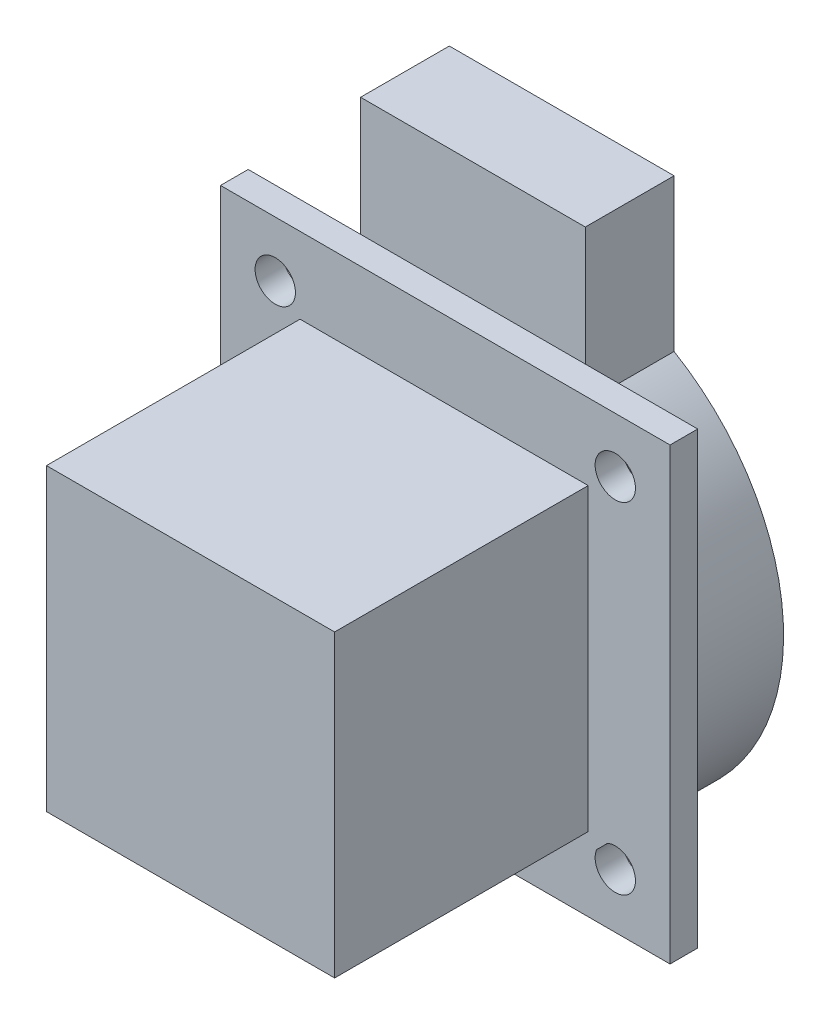
ISO-10303-21;
HEADER;
FILE_DESCRIPTION(('STEP AP214'),'2;1');
FILE_NAME('part.step','',(''),(''),'','','');
FILE_SCHEMA(('AUTOMOTIVE_DESIGN { 1 0 10303 214 1 1 1 1 }'));
ENDSEC;
DATA;
#1=APPLICATION_CONTEXT('core data for automotive mechanical design processes');
#2=APPLICATION_PROTOCOL_DEFINITION('international standard','automotive_design',2000,#1);
#3=PRODUCT_CONTEXT('',#1,'mechanical');
#4=PRODUCT('Part','Part','',(#3));
#5=PRODUCT_RELATED_PRODUCT_CATEGORY('part','',(#4));
#6=PRODUCT_DEFINITION_FORMATION('','',#4);
#7=PRODUCT_DEFINITION_CONTEXT('part definition',#1,'design');
#8=PRODUCT_DEFINITION('design','',#6,#7);
#9=PRODUCT_DEFINITION_SHAPE('','',#8);
#10=(LENGTH_UNIT() NAMED_UNIT(*) SI_UNIT(.MILLI.,.METRE.));
#11=(NAMED_UNIT(*) PLANE_ANGLE_UNIT() SI_UNIT($,.RADIAN.));
#12=(NAMED_UNIT(*) SI_UNIT($,.STERADIAN.) SOLID_ANGLE_UNIT());
#13=UNCERTAINTY_MEASURE_WITH_UNIT(LENGTH_MEASURE(1.E-05),#10,'distance_accuracy_value','');
#14=(GEOMETRIC_REPRESENTATION_CONTEXT(3) GLOBAL_UNCERTAINTY_ASSIGNED_CONTEXT((#13)) GLOBAL_UNIT_ASSIGNED_CONTEXT((#10,
#11,#12)) REPRESENTATION_CONTEXT('',''));
#15=CARTESIAN_POINT('',(0.,0.,0.));
#16=DIRECTION('',(0.,0.,1.));
#17=DIRECTION('',(1.,0.,0.));
#18=AXIS2_PLACEMENT_3D('',#15,#16,#17);
#19=CARTESIAN_POINT('',(0.,0.,3.048));
#20=DIRECTION('',(0.,0.,-1.));
#21=DIRECTION('',(-1.,0.,0.));
#22=AXIS2_PLACEMENT_3D('',#19,#20,#21);
#23=PLANE('',#22);
#24=DIRECTION('',(0.,-1.,0.));
#25=VECTOR('',#24,1.);
#26=CARTESIAN_POINT('',(0.,0.,3.048));
#27=LINE('',#26,#25);
#28=CARTESIAN_POINT('',(0.,49.53,3.048));
#29=VERTEX_POINT('',#28);
#30=CARTESIAN_POINT('',(0.,0.,3.048));
#31=VERTEX_POINT('',#30);
#32=EDGE_CURVE('E257',#29,#31,#27,.T.);
#33=ORIENTED_EDGE('',*,*,#32,.T.);
#34=DIRECTION('',(1.,0.,0.));
#35=VECTOR('',#34,1.);
#36=CARTESIAN_POINT('',(0.,0.,3.048));
#37=LINE('',#36,#35);
#38=CARTESIAN_POINT('',(49.53,0.,3.048));
#39=VERTEX_POINT('',#38);
#40=EDGE_CURVE('E260',#31,#39,#37,.T.);
#41=ORIENTED_EDGE('',*,*,#40,.T.);
#42=DIRECTION('',(0.,1.,0.));
#43=VECTOR('',#42,1.);
#44=CARTESIAN_POINT('',(49.53,0.,3.048));
#45=LINE('',#44,#43);
#46=CARTESIAN_POINT('',(49.53,49.53,3.048));
#47=VERTEX_POINT('',#46);
#48=EDGE_CURVE('E263',#39,#47,#45,.T.);
#49=ORIENTED_EDGE('',*,*,#48,.T.);
#50=DIRECTION('',(-1.,0.,0.));
#51=VECTOR('',#50,1.);
#52=CARTESIAN_POINT('',(0.,49.53,3.048));
#53=LINE('',#52,#51);
#54=EDGE_CURVE('E265',#47,#29,#53,.T.);
#55=ORIENTED_EDGE('',*,*,#54,.T.);
#56=EDGE_LOOP('',(#33,#41,#49,#55));
#57=FACE_BOUND('',#56,.T.);
#58=CARTESIAN_POINT('',(43.4975,6.0325,3.048));
#59=DIRECTION('',(0.,0.,-1.));
#60=DIRECTION('',(-1.,0.,0.));
#61=AXIS2_PLACEMENT_3D('',#58,#59,#60);
#62=CIRCLE('',#61,2.2225);
#63=CARTESIAN_POINT('',(42.6341408354169,8.08045439473893,3.048));
#64=VERTEX_POINT('',#63);
#65=CARTESIAN_POINT('',(41.4495456052611,6.89585916458308,3.048));
#66=VERTEX_POINT('',#65);
#67=EDGE_CURVE('E289',#64,#66,#62,.T.);
#68=ORIENTED_EDGE('',*,*,#67,.T.);
#69=CARTESIAN_POINT('',(24.765,24.765,3.048));
#70=DIRECTION('',(0.,0.,-1.));
#71=DIRECTION('',(-1.,0.,0.));
#72=AXIS2_PLACEMENT_3D('',#69,#70,#71);
#73=CIRCLE('',#72,24.4475);
#74=EDGE_CURVE('E292',#66,#64,#73,.F.);
#75=ORIENTED_EDGE('',*,*,#74,.T.);
#76=EDGE_LOOP('',(#68,#75));
#77=FACE_BOUND('',#76,.T.);
#78=CARTESIAN_POINT('',(6.096,6.0325,3.048));
#79=DIRECTION('',(0.,0.,-1.));
#80=DIRECTION('',(-1.,0.,0.));
#81=AXIS2_PLACEMENT_3D('',#78,#79,#80);
#82=CIRCLE('',#81,2.2225);
#83=CARTESIAN_POINT('',(8.18077160050913,6.80271660830615,3.048));
#84=VERTEX_POINT('',#83);
#85=CARTESIAN_POINT('',(6.85913316770966,8.11987491082494,3.048));
#86=VERTEX_POINT('',#85);
#87=EDGE_CURVE('E44',#84,#86,#82,.T.);
#88=ORIENTED_EDGE('',*,*,#87,.T.);
#89=CARTESIAN_POINT('',(24.765,24.765,3.048));
#90=DIRECTION('',(0.,0.,-1.));
#91=DIRECTION('',(-1.,0.,0.));
#92=AXIS2_PLACEMENT_3D('',#89,#90,#91);
#93=CIRCLE('',#92,24.4475);
#94=EDGE_CURVE('E11',#86,#84,#93,.F.);
#95=ORIENTED_EDGE('',*,*,#94,.T.);
#96=EDGE_LOOP('',(#88,#95));
#97=FACE_BOUND('',#96,.T.);
#98=CARTESIAN_POINT('',(6.0325,43.434,3.048));
#99=DIRECTION('',(0.,0.,-1.));
#100=DIRECTION('',(-1.,0.,0.));
#101=AXIS2_PLACEMENT_3D('',#98,#99,#100);
#102=CIRCLE('',#101,2.2225);
#103=CARTESIAN_POINT('',(3.81,43.434,3.048));
#104=VERTEX_POINT('',#103);
#105=EDGE_CURVE('E218',#104,#104,#102,.T.);
#106=ORIENTED_EDGE('',*,*,#105,.T.);
#107=EDGE_LOOP('',(#106));
#108=FACE_BOUND('',#107,.T.);
#109=CARTESIAN_POINT('',(43.4975,43.4975,3.048));
#110=DIRECTION('',(0.,0.,-1.));
#111=DIRECTION('',(-1.,0.,0.));
#112=AXIS2_PLACEMENT_3D('',#109,#110,#111);
#113=CIRCLE('',#112,2.2225);
#114=CARTESIAN_POINT('',(41.275,43.4975,3.048));
#115=VERTEX_POINT('',#114);
#116=EDGE_CURVE('E39',#115,#115,#113,.T.);
#117=ORIENTED_EDGE('',*,*,#116,.T.);
#118=EDGE_LOOP('',(#117));
#119=FACE_BOUND('',#118,.T.);
#120=DIRECTION('',(-1.,0.,0.));
#121=VECTOR('',#120,1.);
#122=CARTESIAN_POINT('',(0.,41.148,3.048));
#123=LINE('',#122,#121);
#124=CARTESIAN_POINT('',(40.513,41.148,3.048));
#125=VERTEX_POINT('',#124);
#126=CARTESIAN_POINT('',(8.763,41.148,3.048));
#127=VERTEX_POINT('',#126);
#128=EDGE_CURVE('E191',#125,#127,#123,.T.);
#129=ORIENTED_EDGE('',*,*,#128,.F.);
#130=DIRECTION('',(0.,-1.,0.));
#131=VECTOR('',#130,1.);
#132=CARTESIAN_POINT('',(40.513,0.,3.048));
#133=LINE('',#132,#131);
#134=CARTESIAN_POINT('',(40.513,8.128,3.048));
#135=VERTEX_POINT('',#134);
#136=EDGE_CURVE('E187',#125,#135,#133,.T.);
#137=ORIENTED_EDGE('',*,*,#136,.T.);
#138=DIRECTION('',(-1.,0.,0.));
#139=VECTOR('',#138,1.);
#140=CARTESIAN_POINT('',(0.,8.128,3.048));
#141=LINE('',#140,#139);
#142=CARTESIAN_POINT('',(8.763,8.128,3.048));
#143=VERTEX_POINT('',#142);
#144=EDGE_CURVE('E52',#135,#143,#141,.T.);
#145=ORIENTED_EDGE('',*,*,#144,.T.);
#146=DIRECTION('',(0.,-1.,0.));
#147=VECTOR('',#146,1.);
#148=CARTESIAN_POINT('',(8.763,0.,3.048));
#149=LINE('',#148,#147);
#150=EDGE_CURVE('E513',#127,#143,#149,.T.);
#151=ORIENTED_EDGE('',*,*,#150,.F.);
#152=EDGE_LOOP('',(#129,#137,#145,#151));
#153=FACE_BOUND('',#152,.T.);
#154=ADVANCED_FACE('F35',(#57,#77,#97,#108,#119,#153),#23,.F.);
#155=CARTESIAN_POINT('',(0.,0.,0.));
#156=DIRECTION('',(0.,0.,-1.));
#157=DIRECTION('',(-1.,0.,0.));
#158=AXIS2_PLACEMENT_3D('',#155,#156,#157);
#159=PLANE('',#158);
#160=CARTESIAN_POINT('',(43.4975,43.4975,0.));
#161=DIRECTION('',(0.,0.,-1.));
#162=DIRECTION('',(-1.,0.,0.));
#163=AXIS2_PLACEMENT_3D('',#160,#161,#162);
#164=CIRCLE('',#163,2.2225);
#165=CARTESIAN_POINT('',(41.4495456052611,42.6341408354169,0.));
#166=VERTEX_POINT('',#165);
#167=CARTESIAN_POINT('',(42.6341408354169,41.4495456052611,0.));
#168=VERTEX_POINT('',#167);
#169=EDGE_CURVE('E193',#166,#168,#164,.T.);
#170=ORIENTED_EDGE('',*,*,#169,.F.);
#171=CARTESIAN_POINT('',(24.765,24.765,0.));
#172=DIRECTION('',(0.,0.,-1.));
#173=DIRECTION('',(-1.,0.,0.));
#174=AXIS2_PLACEMENT_3D('',#171,#172,#173);
#175=CIRCLE('',#174,24.4475);
#176=CARTESIAN_POINT('',(37.1475,45.8447046943262,0.));
#177=VERTEX_POINT('',#176);
#178=EDGE_CURVE('E235',#177,#166,#175,.T.);
#179=ORIENTED_EDGE('',*,*,#178,.F.);
#180=DIRECTION('',(0.,1.,0.));
#181=VECTOR('',#180,1.);
#182=CARTESIAN_POINT('',(37.1475,0.,0.));
#183=LINE('',#182,#181);
#184=CARTESIAN_POINT('',(37.1475,49.53,0.));
#185=VERTEX_POINT('',#184);
#186=EDGE_CURVE('E231',#177,#185,#183,.T.);
#187=ORIENTED_EDGE('',*,*,#186,.T.);
#188=DIRECTION('',(-1.,0.,0.));
#189=VECTOR('',#188,1.);
#190=CARTESIAN_POINT('',(0.,49.53,0.));
#191=LINE('',#190,#189);
#192=CARTESIAN_POINT('',(49.53,49.53,0.));
#193=VERTEX_POINT('',#192);
#194=EDGE_CURVE('E261',#193,#185,#191,.T.);
#195=ORIENTED_EDGE('',*,*,#194,.F.);
#196=DIRECTION('',(0.,1.,0.));
#197=VECTOR('',#196,1.);
#198=CARTESIAN_POINT('',(49.53,0.,0.));
#199=LINE('',#198,#197);
#200=CARTESIAN_POINT('',(49.53,0.,0.));
#201=VERTEX_POINT('',#200);
#202=EDGE_CURVE('E272',#201,#193,#199,.T.);
#203=ORIENTED_EDGE('',*,*,#202,.F.);
#204=DIRECTION('',(1.,0.,0.));
#205=VECTOR('',#204,1.);
#206=CARTESIAN_POINT('',(0.,0.,0.));
#207=LINE('',#206,#205);
#208=CARTESIAN_POINT('',(0.,0.,0.));
#209=VERTEX_POINT('',#208);
#210=EDGE_CURVE('E270',#209,#201,#207,.T.);
#211=ORIENTED_EDGE('',*,*,#210,.F.);
#212=DIRECTION('',(0.,-1.,0.));
#213=VECTOR('',#212,1.);
#214=CARTESIAN_POINT('',(0.,0.,0.));
#215=LINE('',#214,#213);
#216=CARTESIAN_POINT('',(0.,49.53,0.));
#217=VERTEX_POINT('',#216);
#218=EDGE_CURVE('E256',#217,#209,#215,.T.);
#219=ORIENTED_EDGE('',*,*,#218,.F.);
#220=CARTESIAN_POINT('',(12.3825,49.53,0.));
#221=VERTEX_POINT('',#220);
#222=EDGE_CURVE('E274',#221,#217,#191,.T.);
#223=ORIENTED_EDGE('',*,*,#222,.F.);
#224=DIRECTION('',(0.,1.,0.));
#225=VECTOR('',#224,1.);
#226=CARTESIAN_POINT('',(12.3825,0.,0.));
#227=LINE('',#226,#225);
#228=CARTESIAN_POINT('',(12.3825,45.8447046943262,0.));
#229=VERTEX_POINT('',#228);
#230=EDGE_CURVE('E240',#229,#221,#227,.T.);
#231=ORIENTED_EDGE('',*,*,#230,.F.);
#232=CARTESIAN_POINT('',(8.11987491082494,42.6708668322903,0.));
#233=VERTEX_POINT('',#232);
#234=EDGE_CURVE('E233',#233,#229,#175,.T.);
#235=ORIENTED_EDGE('',*,*,#234,.F.);
#236=CARTESIAN_POINT('',(6.0325,43.434,0.));
#237=DIRECTION('',(0.,0.,-1.));
#238=DIRECTION('',(-1.,0.,0.));
#239=AXIS2_PLACEMENT_3D('',#236,#237,#238);
#240=CIRCLE('',#239,2.2225);
#241=CARTESIAN_POINT('',(6.80271660830616,41.3492283994909,0.));
#242=VERTEX_POINT('',#241);
#243=EDGE_CURVE('E210',#242,#233,#240,.T.);
#244=ORIENTED_EDGE('',*,*,#243,.F.);
#245=CARTESIAN_POINT('',(6.85913316770966,8.11987491082495,0.));
#246=VERTEX_POINT('',#245);
#247=EDGE_CURVE('E530',#246,#242,#175,.T.);
#248=ORIENTED_EDGE('',*,*,#247,.F.);
#249=CARTESIAN_POINT('',(6.096,6.0325,0.));
#250=DIRECTION('',(0.,0.,-1.));
#251=DIRECTION('',(-1.,0.,0.));
#252=AXIS2_PLACEMENT_3D('',#249,#250,#251);
#253=CIRCLE('',#252,2.2225);
#254=CARTESIAN_POINT('',(8.18077160050913,6.80271660830615,0.));
#255=VERTEX_POINT('',#254);
#256=EDGE_CURVE('E204',#255,#246,#253,.T.);
#257=ORIENTED_EDGE('',*,*,#256,.F.);
#258=CARTESIAN_POINT('',(41.4495456052611,6.89585916458309,0.));
#259=VERTEX_POINT('',#258);
#260=EDGE_CURVE('E528',#259,#255,#175,.T.);
#261=ORIENTED_EDGE('',*,*,#260,.F.);
#262=CARTESIAN_POINT('',(43.4975,6.0325,0.));
#263=DIRECTION('',(0.,0.,-1.));
#264=DIRECTION('',(-1.,0.,0.));
#265=AXIS2_PLACEMENT_3D('',#262,#263,#264);
#266=CIRCLE('',#265,2.2225);
#267=CARTESIAN_POINT('',(42.6341408354169,8.08045439473893,0.));
#268=VERTEX_POINT('',#267);
#269=EDGE_CURVE('E208',#268,#259,#266,.T.);
#270=ORIENTED_EDGE('',*,*,#269,.F.);
#271=EDGE_CURVE('E525',#168,#268,#175,.T.);
#272=ORIENTED_EDGE('',*,*,#271,.F.);
#273=EDGE_LOOP('',(#170,#179,#187,#195,#203,#211,#219,#223,#231,#235,#244,#248,#257,#261,#270,#272));
#274=FACE_BOUND('',#273,.T.);
#275=ADVANCED_FACE('F326',(#274),#159,.T.);
#276=CARTESIAN_POINT('',(0.,0.,3.048));
#277=DIRECTION('',(1.,0.,0.));
#278=DIRECTION('',(0.,0.,-1.));
#279=AXIS2_PLACEMENT_3D('',#276,#277,#278);
#280=PLANE('',#279);
#281=ORIENTED_EDGE('',*,*,#218,.T.);
#282=DIRECTION('',(0.,0.,-1.));
#283=VECTOR('',#282,1.);
#284=CARTESIAN_POINT('',(0.,0.,3.048));
#285=LINE('',#284,#283);
#286=EDGE_CURVE('E286',#31,#209,#285,.T.);
#287=ORIENTED_EDGE('',*,*,#286,.F.);
#288=ORIENTED_EDGE('',*,*,#32,.F.);
#289=DIRECTION('',(0.,0.,-1.));
#290=VECTOR('',#289,1.);
#291=CARTESIAN_POINT('',(0.,49.53,3.048));
#292=LINE('',#291,#290);
#293=EDGE_CURVE('E267',#29,#217,#292,.T.);
#294=ORIENTED_EDGE('',*,*,#293,.T.);
#295=EDGE_LOOP('',(#281,#287,#288,#294));
#296=FACE_BOUND('',#295,.T.);
#297=ADVANCED_FACE('F37',(#296),#280,.F.);
#298=CARTESIAN_POINT('',(0.,0.,3.048));
#299=DIRECTION('',(0.,1.,0.));
#300=DIRECTION('',(0.,0.,1.));
#301=AXIS2_PLACEMENT_3D('',#298,#299,#300);
#302=PLANE('',#301);
#303=ORIENTED_EDGE('',*,*,#210,.T.);
#304=DIRECTION('',(0.,0.,-1.));
#305=VECTOR('',#304,1.);
#306=CARTESIAN_POINT('',(49.53,0.,3.048));
#307=LINE('',#306,#305);
#308=EDGE_CURVE('E283',#39,#201,#307,.T.);
#309=ORIENTED_EDGE('',*,*,#308,.F.);
#310=ORIENTED_EDGE('',*,*,#40,.F.);
#311=ORIENTED_EDGE('',*,*,#286,.T.);
#312=EDGE_LOOP('',(#303,#309,#310,#311));
#313=FACE_BOUND('',#312,.T.);
#314=ADVANCED_FACE('F367',(#313),#302,.F.);
#315=CARTESIAN_POINT('',(49.53,0.,3.048));
#316=DIRECTION('',(-1.,0.,0.));
#317=DIRECTION('',(0.,0.,1.));
#318=AXIS2_PLACEMENT_3D('',#315,#316,#317);
#319=PLANE('',#318);
#320=ORIENTED_EDGE('',*,*,#202,.T.);
#321=DIRECTION('',(0.,0.,-1.));
#322=VECTOR('',#321,1.);
#323=CARTESIAN_POINT('',(49.53,49.53,3.048));
#324=LINE('',#323,#322);
#325=EDGE_CURVE('E280',#47,#193,#324,.T.);
#326=ORIENTED_EDGE('',*,*,#325,.F.);
#327=ORIENTED_EDGE('',*,*,#48,.F.);
#328=ORIENTED_EDGE('',*,*,#308,.T.);
#329=EDGE_LOOP('',(#320,#326,#327,#328));
#330=FACE_BOUND('',#329,.T.);
#331=ADVANCED_FACE('F365',(#330),#319,.F.);
#332=CARTESIAN_POINT('',(0.,49.53,3.048));
#333=DIRECTION('',(0.,-1.,0.));
#334=DIRECTION('',(0.,0.,-1.));
#335=AXIS2_PLACEMENT_3D('',#332,#333,#334);
#336=PLANE('',#335);
#337=ORIENTED_EDGE('',*,*,#194,.T.);
#338=EDGE_CURVE('E277',#185,#221,#191,.T.);
#339=ORIENTED_EDGE('',*,*,#338,.T.);
#340=ORIENTED_EDGE('',*,*,#222,.T.);
#341=ORIENTED_EDGE('',*,*,#293,.F.);
#342=ORIENTED_EDGE('',*,*,#54,.F.);
#343=ORIENTED_EDGE('',*,*,#325,.T.);
#344=EDGE_LOOP('',(#337,#339,#340,#341,#342,#343));
#345=FACE_BOUND('',#344,.T.);
#346=ADVANCED_FACE('F332',(#345),#336,.F.);
#347=CARTESIAN_POINT('',(37.1475,0.,-9.779));
#348=DIRECTION('',(1.,0.,0.));
#349=DIRECTION('',(0.,0.,-1.));
#350=AXIS2_PLACEMENT_3D('',#347,#348,#349);
#351=PLANE('',#350);
#352=ORIENTED_EDGE('',*,*,#186,.F.);
#353=DIRECTION('',(0.,0.,1.));
#354=VECTOR('',#353,1.);
#355=CARTESIAN_POINT('',(37.1475,45.8447046943262,-9.779));
#356=LINE('',#355,#354);
#357=CARTESIAN_POINT('',(37.1475,45.8447046943262,-9.779));
#358=VERTEX_POINT('',#357);
#359=EDGE_CURVE('E253',#358,#177,#356,.T.);
#360=ORIENTED_EDGE('',*,*,#359,.F.);
#361=DIRECTION('',(0.,1.,0.));
#362=VECTOR('',#361,1.);
#363=CARTESIAN_POINT('',(37.1475,0.,-9.779));
#364=LINE('',#363,#362);
#365=CARTESIAN_POINT('',(37.1475,62.611,-9.779));
#366=VERTEX_POINT('',#365);
#367=EDGE_CURVE('E220',#358,#366,#364,.T.);
#368=ORIENTED_EDGE('',*,*,#367,.T.);
#369=DIRECTION('',(0.,0.,1.));
#370=VECTOR('',#369,1.);
#371=CARTESIAN_POINT('',(37.1475,62.611,-9.779));
#372=LINE('',#371,#370);
#373=CARTESIAN_POINT('',(37.1475,62.611,0.));
#374=VERTEX_POINT('',#373);
#375=EDGE_CURVE('E230',#366,#374,#372,.T.);
#376=ORIENTED_EDGE('',*,*,#375,.T.);
#377=EDGE_CURVE('E234',#185,#374,#183,.T.);
#378=ORIENTED_EDGE('',*,*,#377,.F.);
#379=EDGE_LOOP('',(#352,#360,#368,#376,#378));
#380=FACE_BOUND('',#379,.T.);
#381=ADVANCED_FACE('F312',(#380),#351,.T.);
#382=CARTESIAN_POINT('',(24.765,24.765,-9.779));
#383=DIRECTION('',(0.,0.,1.));
#384=DIRECTION('',(1.,0.,0.));
#385=AXIS2_PLACEMENT_3D('',#382,#383,#384);
#386=CYLINDRICAL_SURFACE('',#385,24.4475);
#387=ORIENTED_EDGE('',*,*,#178,.T.);
#388=EDGE_CURVE('E239',#166,#168,#175,.T.);
#389=ORIENTED_EDGE('',*,*,#388,.T.);
#390=ORIENTED_EDGE('',*,*,#271,.T.);
#391=DIRECTION('',(0.,0.,-1.));
#392=VECTOR('',#391,1.);
#393=CARTESIAN_POINT('',(42.6341408354169,8.08045439473893,9.779));
#394=LINE('',#393,#392);
#395=EDGE_CURVE('E214',#64,#268,#394,.T.);
#396=ORIENTED_EDGE('',*,*,#395,.F.);
#397=ORIENTED_EDGE('',*,*,#74,.F.);
#398=DIRECTION('',(0.,0.,-1.));
#399=VECTOR('',#398,1.);
#400=CARTESIAN_POINT('',(41.4495456052611,6.89585916458309,9.779));
#401=LINE('',#400,#399);
#402=EDGE_CURVE('E215',#66,#259,#401,.T.);
#403=ORIENTED_EDGE('',*,*,#402,.T.);
#404=ORIENTED_EDGE('',*,*,#260,.T.);
#405=DIRECTION('',(0.,0.,-1.));
#406=VECTOR('',#405,1.);
#407=CARTESIAN_POINT('',(8.18077160050913,6.80271660830615,9.779));
#408=LINE('',#407,#406);
#409=EDGE_CURVE('E202',#84,#255,#408,.T.);
#410=ORIENTED_EDGE('',*,*,#409,.F.);
#411=ORIENTED_EDGE('',*,*,#94,.F.);
#412=DIRECTION('',(0.,0.,-1.));
#413=VECTOR('',#412,1.);
#414=CARTESIAN_POINT('',(6.85913316770966,8.11987491082495,9.779));
#415=LINE('',#414,#413);
#416=EDGE_CURVE('E60',#86,#246,#415,.T.);
#417=ORIENTED_EDGE('',*,*,#416,.T.);
#418=ORIENTED_EDGE('',*,*,#247,.T.);
#419=EDGE_CURVE('E533',#242,#233,#175,.T.);
#420=ORIENTED_EDGE('',*,*,#419,.T.);
#421=ORIENTED_EDGE('',*,*,#234,.T.);
#422=DIRECTION('',(0.,0.,1.));
#423=VECTOR('',#422,1.);
#424=CARTESIAN_POINT('',(12.3825,45.8447046943262,-9.779));
#425=LINE('',#424,#423);
#426=CARTESIAN_POINT('',(12.3825,45.8447046943262,-9.779));
#427=VERTEX_POINT('',#426);
#428=EDGE_CURVE('E250',#427,#229,#425,.T.);
#429=ORIENTED_EDGE('',*,*,#428,.F.);
#430=CARTESIAN_POINT('',(24.765,24.765,-9.779));
#431=DIRECTION('',(0.,0.,-1.));
#432=DIRECTION('',(-1.,0.,0.));
#433=AXIS2_PLACEMENT_3D('',#430,#431,#432);
#434=CIRCLE('',#433,24.4475);
#435=EDGE_CURVE('E223',#358,#427,#434,.T.);
#436=ORIENTED_EDGE('',*,*,#435,.F.);
#437=ORIENTED_EDGE('',*,*,#359,.T.);
#438=EDGE_LOOP('',(#387,#389,#390,#396,#397,#403,#404,#410,#411,#417,#418,#420,#421,#429,#436,#437));
#439=FACE_BOUND('',#438,.T.);
#440=ADVANCED_FACE('F339',(#439),#386,.T.);
#441=CARTESIAN_POINT('',(12.3825,0.,-9.779));
#442=DIRECTION('',(1.,0.,0.));
#443=DIRECTION('',(0.,0.,-1.));
#444=AXIS2_PLACEMENT_3D('',#441,#442,#443);
#445=PLANE('',#444);
#446=ORIENTED_EDGE('',*,*,#230,.T.);
#447=CARTESIAN_POINT('',(12.3825,62.611,0.));
#448=VERTEX_POINT('',#447);
#449=EDGE_CURVE('E238',#221,#448,#227,.T.);
#450=ORIENTED_EDGE('',*,*,#449,.T.);
#451=DIRECTION('',(0.,0.,1.));
#452=VECTOR('',#451,1.);
#453=CARTESIAN_POINT('',(12.3825,62.611,-9.779));
#454=LINE('',#453,#452);
#455=CARTESIAN_POINT('',(12.3825,62.611,-9.779));
#456=VERTEX_POINT('',#455);
#457=EDGE_CURVE('E247',#456,#448,#454,.T.);
#458=ORIENTED_EDGE('',*,*,#457,.F.);
#459=DIRECTION('',(0.,1.,0.));
#460=VECTOR('',#459,1.);
#461=CARTESIAN_POINT('',(12.3825,0.,-9.779));
#462=LINE('',#461,#460);
#463=EDGE_CURVE('E226',#427,#456,#462,.T.);
#464=ORIENTED_EDGE('',*,*,#463,.F.);
#465=ORIENTED_EDGE('',*,*,#428,.T.);
#466=EDGE_LOOP('',(#446,#450,#458,#464,#465));
#467=FACE_BOUND('',#466,.T.);
#468=ADVANCED_FACE('F320',(#467),#445,.F.);
#469=CARTESIAN_POINT('',(0.,62.611,-9.779));
#470=DIRECTION('',(0.,-1.,0.));
#471=DIRECTION('',(0.,0.,-1.));
#472=AXIS2_PLACEMENT_3D('',#469,#470,#471);
#473=PLANE('',#472);
#474=DIRECTION('',(1.,0.,0.));
#475=VECTOR('',#474,1.);
#476=CARTESIAN_POINT('',(0.,62.611,0.));
#477=LINE('',#476,#475);
#478=EDGE_CURVE('E224',#448,#374,#477,.T.);
#479=ORIENTED_EDGE('',*,*,#478,.T.);
#480=ORIENTED_EDGE('',*,*,#375,.F.);
#481=DIRECTION('',(1.,0.,0.));
#482=VECTOR('',#481,1.);
#483=CARTESIAN_POINT('',(0.,62.611,-9.779));
#484=LINE('',#483,#482);
#485=EDGE_CURVE('E228',#456,#366,#484,.T.);
#486=ORIENTED_EDGE('',*,*,#485,.F.);
#487=ORIENTED_EDGE('',*,*,#457,.T.);
#488=EDGE_LOOP('',(#479,#480,#486,#487));
#489=FACE_BOUND('',#488,.T.);
#490=ADVANCED_FACE('F316',(#489),#473,.F.);
#491=CARTESIAN_POINT('',(0.,0.,-9.779));
#492=DIRECTION('',(0.,0.,-1.));
#493=DIRECTION('',(-1.,0.,0.));
#494=AXIS2_PLACEMENT_3D('',#491,#492,#493);
#495=PLANE('',#494);
#496=ORIENTED_EDGE('',*,*,#367,.F.);
#497=ORIENTED_EDGE('',*,*,#435,.T.);
#498=ORIENTED_EDGE('',*,*,#463,.T.);
#499=ORIENTED_EDGE('',*,*,#485,.T.);
#500=EDGE_LOOP('',(#496,#497,#498,#499));
#501=FACE_BOUND('',#500,.T.);
#502=ADVANCED_FACE('F341',(#501),#495,.T.);
#503=CARTESIAN_POINT('',(0.,0.,0.));
#504=DIRECTION('',(0.,0.,-1.));
#505=DIRECTION('',(-1.,0.,0.));
#506=AXIS2_PLACEMENT_3D('',#503,#504,#505);
#507=PLANE('',#506);
#508=ORIENTED_EDGE('',*,*,#338,.F.);
#509=ORIENTED_EDGE('',*,*,#377,.T.);
#510=ORIENTED_EDGE('',*,*,#478,.F.);
#511=ORIENTED_EDGE('',*,*,#449,.F.);
#512=EDGE_LOOP('',(#508,#509,#510,#511));
#513=FACE_BOUND('',#512,.T.);
#514=ADVANCED_FACE('F306',(#513),#507,.F.);
#515=CARTESIAN_POINT('',(43.4975,6.0325,9.779));
#516=DIRECTION('',(0.,0.,-1.));
#517=DIRECTION('',(-1.,0.,0.));
#518=AXIS2_PLACEMENT_3D('',#515,#516,#517);
#519=CYLINDRICAL_SURFACE('',#518,2.2225);
#520=ORIENTED_EDGE('',*,*,#395,.T.);
#521=ORIENTED_EDGE('',*,*,#269,.T.);
#522=ORIENTED_EDGE('',*,*,#402,.F.);
#523=ORIENTED_EDGE('',*,*,#67,.F.);
#524=EDGE_LOOP('',(#520,#521,#522,#523));
#525=FACE_BOUND('',#524,.T.);
#526=ADVANCED_FACE('F348',(#525),#519,.F.);
#527=CARTESIAN_POINT('',(6.096,6.0325,9.779));
#528=DIRECTION('',(0.,0.,-1.));
#529=DIRECTION('',(-1.,0.,0.));
#530=AXIS2_PLACEMENT_3D('',#527,#528,#529);
#531=CYLINDRICAL_SURFACE('',#530,2.2225);
#532=ORIENTED_EDGE('',*,*,#409,.T.);
#533=ORIENTED_EDGE('',*,*,#256,.T.);
#534=ORIENTED_EDGE('',*,*,#416,.F.);
#535=ORIENTED_EDGE('',*,*,#87,.F.);
#536=EDGE_LOOP('',(#532,#533,#534,#535));
#537=FACE_BOUND('',#536,.T.);
#538=ADVANCED_FACE('F409',(#537),#531,.F.);
#539=CARTESIAN_POINT('',(6.0325,43.434,9.779));
#540=DIRECTION('',(0.,0.,-1.));
#541=DIRECTION('',(-1.,0.,0.));
#542=AXIS2_PLACEMENT_3D('',#539,#540,#541);
#543=CYLINDRICAL_SURFACE('',#542,2.2225);
#544=EDGE_CURVE('E206',#233,#242,#240,.T.);
#545=ORIENTED_EDGE('',*,*,#544,.T.);
#546=ORIENTED_EDGE('',*,*,#243,.T.);
#547=EDGE_LOOP('',(#545,#546));
#548=FACE_BOUND('',#547,.T.);
#549=ORIENTED_EDGE('',*,*,#105,.F.);
#550=EDGE_LOOP('',(#549));
#551=FACE_BOUND('',#550,.T.);
#552=ADVANCED_FACE('F418',(#548,#551),#543,.F.);
#553=CARTESIAN_POINT('',(6.0325,43.434,0.));
#554=DIRECTION('',(0.,0.,-1.));
#555=DIRECTION('',(-1.,0.,0.));
#556=AXIS2_PLACEMENT_3D('',#553,#554,#555);
#557=PLANE('',#556);
#558=ORIENTED_EDGE('',*,*,#544,.F.);
#559=ORIENTED_EDGE('',*,*,#419,.F.);
#560=EDGE_LOOP('',(#558,#559));
#561=FACE_BOUND('',#560,.T.);
#562=ADVANCED_FACE('F427',(#561),#557,.F.);
#563=CARTESIAN_POINT('',(43.4975,43.4975,9.779));
#564=DIRECTION('',(0.,0.,-1.));
#565=DIRECTION('',(-1.,0.,0.));
#566=AXIS2_PLACEMENT_3D('',#563,#564,#565);
#567=CYLINDRICAL_SURFACE('',#566,2.2225);
#568=EDGE_CURVE('E196',#168,#166,#164,.T.);
#569=ORIENTED_EDGE('',*,*,#568,.T.);
#570=ORIENTED_EDGE('',*,*,#169,.T.);
#571=EDGE_LOOP('',(#569,#570));
#572=FACE_BOUND('',#571,.T.);
#573=ORIENTED_EDGE('',*,*,#116,.F.);
#574=EDGE_LOOP('',(#573));
#575=FACE_BOUND('',#574,.T.);
#576=ADVANCED_FACE('F437',(#572,#575),#567,.F.);
#577=CARTESIAN_POINT('',(43.4975,43.4975,0.));
#578=DIRECTION('',(0.,0.,-1.));
#579=DIRECTION('',(-1.,0.,0.));
#580=AXIS2_PLACEMENT_3D('',#577,#578,#579);
#581=PLANE('',#580);
#582=ORIENTED_EDGE('',*,*,#568,.F.);
#583=ORIENTED_EDGE('',*,*,#388,.F.);
#584=EDGE_LOOP('',(#582,#583));
#585=FACE_BOUND('',#584,.T.);
#586=ADVANCED_FACE('F447',(#585),#581,.F.);
#587=CARTESIAN_POINT('',(0.,41.148,30.988));
#588=DIRECTION('',(0.,-1.,0.));
#589=DIRECTION('',(0.,0.,-1.));
#590=AXIS2_PLACEMENT_3D('',#587,#588,#589);
#591=PLANE('',#590);
#592=ORIENTED_EDGE('',*,*,#128,.T.);
#593=DIRECTION('',(0.,0.,-1.));
#594=VECTOR('',#593,1.);
#595=CARTESIAN_POINT('',(8.763,41.148,30.988));
#596=LINE('',#595,#594);
#597=CARTESIAN_POINT('',(8.763,41.148,30.988));
#598=VERTEX_POINT('',#597);
#599=EDGE_CURVE('E172',#598,#127,#596,.T.);
#600=ORIENTED_EDGE('',*,*,#599,.F.);
#601=DIRECTION('',(-1.,0.,0.));
#602=VECTOR('',#601,1.);
#603=CARTESIAN_POINT('',(0.,41.148,30.988));
#604=LINE('',#603,#602);
#605=CARTESIAN_POINT('',(40.513,41.148,30.988));
#606=VERTEX_POINT('',#605);
#607=EDGE_CURVE('E179',#606,#598,#604,.T.);
#608=ORIENTED_EDGE('',*,*,#607,.F.);
#609=DIRECTION('',(0.,0.,-1.));
#610=VECTOR('',#609,1.);
#611=CARTESIAN_POINT('',(40.513,41.148,30.988));
#612=LINE('',#611,#610);
#613=EDGE_CURVE('E510',#606,#125,#612,.T.);
#614=ORIENTED_EDGE('',*,*,#613,.T.);
#615=EDGE_LOOP('',(#592,#600,#608,#614));
#616=FACE_BOUND('',#615,.T.);
#617=ADVANCED_FACE('F189',(#616),#591,.F.);
#618=CARTESIAN_POINT('',(8.763,0.,30.988));
#619=DIRECTION('',(1.,0.,0.));
#620=DIRECTION('',(0.,0.,-1.));
#621=AXIS2_PLACEMENT_3D('',#618,#619,#620);
#622=PLANE('',#621);
#623=ORIENTED_EDGE('',*,*,#150,.T.);
#624=DIRECTION('',(0.,0.,-1.));
#625=VECTOR('',#624,1.);
#626=CARTESIAN_POINT('',(8.763,8.128,30.988));
#627=LINE('',#626,#625);
#628=CARTESIAN_POINT('',(8.763,8.128,30.988));
#629=VERTEX_POINT('',#628);
#630=EDGE_CURVE('E174',#629,#143,#627,.T.);
#631=ORIENTED_EDGE('',*,*,#630,.F.);
#632=DIRECTION('',(0.,-1.,0.));
#633=VECTOR('',#632,1.);
#634=CARTESIAN_POINT('',(8.763,0.,30.988));
#635=LINE('',#634,#633);
#636=EDGE_CURVE('E167',#598,#629,#635,.T.);
#637=ORIENTED_EDGE('',*,*,#636,.F.);
#638=ORIENTED_EDGE('',*,*,#599,.T.);
#639=EDGE_LOOP('',(#623,#631,#637,#638));
#640=FACE_BOUND('',#639,.T.);
#641=ADVANCED_FACE('F170',(#640),#622,.F.);
#642=CARTESIAN_POINT('',(0.,8.128,30.988));
#643=DIRECTION('',(0.,-1.,0.));
#644=DIRECTION('',(0.,0.,-1.));
#645=AXIS2_PLACEMENT_3D('',#642,#643,#644);
#646=PLANE('',#645);
#647=ORIENTED_EDGE('',*,*,#144,.F.);
#648=DIRECTION('',(0.,0.,-1.));
#649=VECTOR('',#648,1.);
#650=CARTESIAN_POINT('',(40.513,8.128,30.988));
#651=LINE('',#650,#649);
#652=CARTESIAN_POINT('',(40.513,8.128,30.988));
#653=VERTEX_POINT('',#652);
#654=EDGE_CURVE('E198',#653,#135,#651,.T.);
#655=ORIENTED_EDGE('',*,*,#654,.F.);
#656=DIRECTION('',(-1.,0.,0.));
#657=VECTOR('',#656,1.);
#658=CARTESIAN_POINT('',(0.,8.128,30.988));
#659=LINE('',#658,#657);
#660=EDGE_CURVE('E178',#653,#629,#659,.T.);
#661=ORIENTED_EDGE('',*,*,#660,.T.);
#662=ORIENTED_EDGE('',*,*,#630,.T.);
#663=EDGE_LOOP('',(#647,#655,#661,#662));
#664=FACE_BOUND('',#663,.T.);
#665=ADVANCED_FACE('F478',(#664),#646,.T.);
#666=CARTESIAN_POINT('',(40.513,0.,30.988));
#667=DIRECTION('',(1.,0.,0.));
#668=DIRECTION('',(0.,0.,-1.));
#669=AXIS2_PLACEMENT_3D('',#666,#667,#668);
#670=PLANE('',#669);
#671=ORIENTED_EDGE('',*,*,#136,.F.);
#672=ORIENTED_EDGE('',*,*,#613,.F.);
#673=DIRECTION('',(0.,-1.,0.));
#674=VECTOR('',#673,1.);
#675=CARTESIAN_POINT('',(40.513,0.,30.988));
#676=LINE('',#675,#674);
#677=EDGE_CURVE('E185',#606,#653,#676,.T.);
#678=ORIENTED_EDGE('',*,*,#677,.T.);
#679=ORIENTED_EDGE('',*,*,#654,.T.);
#680=EDGE_LOOP('',(#671,#672,#678,#679));
#681=FACE_BOUND('',#680,.T.);
#682=ADVANCED_FACE('F487',(#681),#670,.T.);
#683=CARTESIAN_POINT('',(0.,0.,30.988));
#684=DIRECTION('',(0.,0.,1.));
#685=DIRECTION('',(1.,0.,0.));
#686=AXIS2_PLACEMENT_3D('',#683,#684,#685);
#687=PLANE('',#686);
#688=ORIENTED_EDGE('',*,*,#607,.T.);
#689=ORIENTED_EDGE('',*,*,#636,.T.);
#690=ORIENTED_EDGE('',*,*,#660,.F.);
#691=ORIENTED_EDGE('',*,*,#677,.F.);
#692=EDGE_LOOP('',(#688,#689,#690,#691));
#693=FACE_BOUND('',#692,.T.);
#694=ADVANCED_FACE('F183',(#693),#687,.T.);
#695=CLOSED_SHELL('',(#154,#275,#297,#314,#331,#346,#381,#440,#468,#490,#502,#514,#526,#538,
#552,#562,#576,#586,#617,#641,#665,#682,#694));
#696=MANIFOLD_SOLID_BREP('B2',#695);
#697=ADVANCED_BREP_SHAPE_REPRESENTATION('',(#18,#696),#14);
#698=SHAPE_DEFINITION_REPRESENTATION(#9,#697);
ENDSEC;
END-ISO-10303-21;
